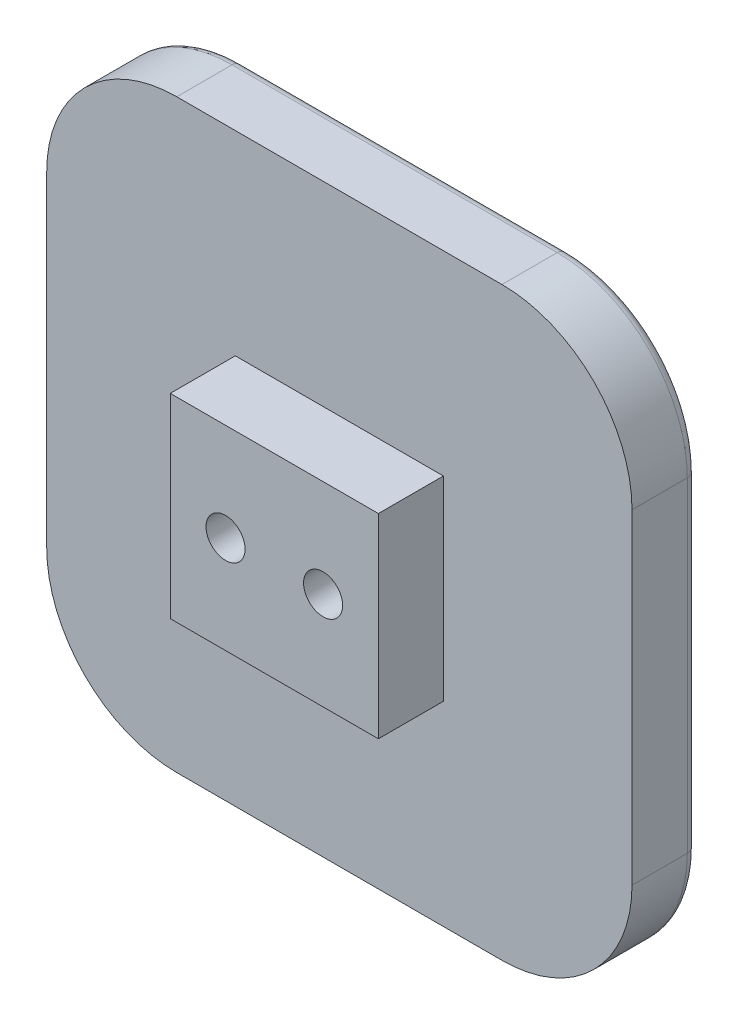
ISO-10303-21;
HEADER;
FILE_DESCRIPTION(('STEP AP214'),'2;1');
FILE_NAME('part.step','',(''),(''),'','','');
FILE_SCHEMA(('AUTOMOTIVE_DESIGN { 1 0 10303 214 1 1 1 1 }'));
ENDSEC;
DATA;
#1=APPLICATION_CONTEXT('core data for automotive mechanical design processes');
#2=APPLICATION_PROTOCOL_DEFINITION('international standard','automotive_design',2000,#1);
#3=PRODUCT_CONTEXT('',#1,'mechanical');
#4=PRODUCT('Part','Part','',(#3));
#5=PRODUCT_RELATED_PRODUCT_CATEGORY('part','',(#4));
#6=PRODUCT_DEFINITION_FORMATION('','',#4);
#7=PRODUCT_DEFINITION_CONTEXT('part definition',#1,'design');
#8=PRODUCT_DEFINITION('design','',#6,#7);
#9=PRODUCT_DEFINITION_SHAPE('','',#8);
#10=(LENGTH_UNIT() NAMED_UNIT(*) SI_UNIT(.MILLI.,.METRE.));
#11=(NAMED_UNIT(*) PLANE_ANGLE_UNIT() SI_UNIT($,.RADIAN.));
#12=(NAMED_UNIT(*) SI_UNIT($,.STERADIAN.) SOLID_ANGLE_UNIT());
#13=UNCERTAINTY_MEASURE_WITH_UNIT(LENGTH_MEASURE(1.E-05),#10,'distance_accuracy_value','');
#14=(GEOMETRIC_REPRESENTATION_CONTEXT(3) GLOBAL_UNCERTAINTY_ASSIGNED_CONTEXT((#13)) GLOBAL_UNIT_ASSIGNED_CONTEXT((#10,
#11,#12)) REPRESENTATION_CONTEXT('',''));
#15=CARTESIAN_POINT('',(0.,0.,0.));
#16=DIRECTION('',(0.,0.,1.));
#17=DIRECTION('',(1.,0.,0.));
#18=AXIS2_PLACEMENT_3D('',#15,#16,#17);
#19=CARTESIAN_POINT('',(-12.5413669644873,38.8891123439667,27.));
#20=DIRECTION('',(0.,1.,0.));
#21=DIRECTION('',(0.,0.,1.));
#22=AXIS2_PLACEMENT_3D('',#19,#20,#21);
#23=PLANE('',#22);
#24=DIRECTION('',(0.,0.,-1.));
#25=VECTOR('',#24,1.);
#26=CARTESIAN_POINT('',(19.4586330355127,38.8891123439667,27.));
#27=LINE('',#26,#25);
#28=CARTESIAN_POINT('',(19.4586330355127,38.8891123439667,20.));
#29=VERTEX_POINT('',#28);
#30=CARTESIAN_POINT('',(19.4586330355127,38.8891123439667,10.));
#31=VERTEX_POINT('',#30);
#32=EDGE_CURVE('E341',#29,#31,#27,.T.);
#33=ORIENTED_EDGE('',*,*,#32,.T.);
#34=DIRECTION('',(1.,0.,0.));
#35=VECTOR('',#34,1.);
#36=CARTESIAN_POINT('',(-12.5413669644873,38.8891123439667,10.));
#37=LINE('',#36,#35);
#38=CARTESIAN_POINT('',(-12.5413669644873,38.8891123439667,10.));
#39=VERTEX_POINT('',#38);
#40=EDGE_CURVE('E158',#39,#31,#37,.T.);
#41=ORIENTED_EDGE('',*,*,#40,.F.);
#42=DIRECTION('',(0.,0.,-1.));
#43=VECTOR('',#42,1.);
#44=CARTESIAN_POINT('',(-12.5413669644873,38.8891123439667,27.));
#45=LINE('',#44,#43);
#46=CARTESIAN_POINT('',(-12.5413669644873,38.8891123439667,20.));
#47=VERTEX_POINT('',#46);
#48=EDGE_CURVE('E338',#47,#39,#45,.T.);
#49=ORIENTED_EDGE('',*,*,#48,.F.);
#50=DIRECTION('',(1.,0.,0.));
#51=VECTOR('',#50,1.);
#52=CARTESIAN_POINT('',(28.4586330355127,38.8891123439667,20.));
#53=LINE('',#52,#51);
#54=EDGE_CURVE('E334',#47,#29,#53,.T.);
#55=ORIENTED_EDGE('',*,*,#54,.T.);
#56=EDGE_LOOP('',(#33,#41,#49,#55));
#57=FACE_BOUND('',#56,.T.);
#58=ADVANCED_FACE('F33',(#57),#23,.T.);
#59=CARTESIAN_POINT('',(28.4586330355127,48.8891123439667,0.));
#60=DIRECTION('',(0.,0.,-1.));
#61=DIRECTION('',(-1.,0.,0.));
#62=AXIS2_PLACEMENT_3D('',#59,#60,#61);
#63=PLANE('',#62);
#64=DIRECTION('',(0.,1.,0.));
#65=VECTOR('',#64,1.);
#66=CARTESIAN_POINT('',(46.9586330355127,-1.11088765603329,0.));
#67=LINE('',#66,#65);
#68=CARTESIAN_POINT('',(46.9586330355127,48.8891123439667,0.));
#69=VERTEX_POINT('',#68);
#70=CARTESIAN_POINT('',(46.9586330355127,-1.11088765603329,0.));
#71=VERTEX_POINT('',#70);
#72=EDGE_CURVE('E213',#69,#71,#67,.F.);
#73=ORIENTED_EDGE('',*,*,#72,.T.);
#74=CARTESIAN_POINT('',(28.4586330355126,-1.11088765603327,0.));
#75=DIRECTION('',(0.,0.,-1.));
#76=DIRECTION('',(-1.,0.,0.));
#77=AXIS2_PLACEMENT_3D('',#74,#75,#76);
#78=CIRCLE('',#77,18.5);
#79=CARTESIAN_POINT('',(28.4586330355126,-19.6108876560332,0.));
#80=VERTEX_POINT('',#79);
#81=EDGE_CURVE('E227',#71,#80,#78,.T.);
#82=ORIENTED_EDGE('',*,*,#81,.T.);
#83=DIRECTION('',(1.,0.,0.));
#84=VECTOR('',#83,1.);
#85=CARTESIAN_POINT('',(-21.5413669644874,-19.6108876560332,0.));
#86=LINE('',#85,#84);
#87=CARTESIAN_POINT('',(-21.5413669644874,-19.6108876560332,0.));
#88=VERTEX_POINT('',#87);
#89=EDGE_CURVE('E225',#80,#88,#86,.F.);
#90=ORIENTED_EDGE('',*,*,#89,.T.);
#91=CARTESIAN_POINT('',(-21.5413669644873,-1.11088765603323,0.));
#92=DIRECTION('',(0.,0.,-1.));
#93=DIRECTION('',(-1.,0.,0.));
#94=AXIS2_PLACEMENT_3D('',#91,#92,#93);
#95=CIRCLE('',#94,18.5);
#96=CARTESIAN_POINT('',(-40.0413669644873,-1.11088765603322,0.));
#97=VERTEX_POINT('',#96);
#98=EDGE_CURVE('E223',#88,#97,#95,.T.);
#99=ORIENTED_EDGE('',*,*,#98,.T.);
#100=DIRECTION('',(0.,-1.,0.));
#101=VECTOR('',#100,1.);
#102=CARTESIAN_POINT('',(-40.0413669644873,48.8891123439667,0.));
#103=LINE('',#102,#101);
#104=CARTESIAN_POINT('',(-40.0413669644873,48.8891123439667,0.));
#105=VERTEX_POINT('',#104);
#106=EDGE_CURVE('E221',#97,#105,#103,.F.);
#107=ORIENTED_EDGE('',*,*,#106,.T.);
#108=CARTESIAN_POINT('',(-21.5413669644873,48.8891123439667,0.));
#109=DIRECTION('',(0.,0.,-1.));
#110=DIRECTION('',(-1.,0.,0.));
#111=AXIS2_PLACEMENT_3D('',#108,#109,#110);
#112=CIRCLE('',#111,18.5);
#113=CARTESIAN_POINT('',(-21.5413669644873,67.3891123439667,0.));
#114=VERTEX_POINT('',#113);
#115=EDGE_CURVE('E219',#105,#114,#112,.T.);
#116=ORIENTED_EDGE('',*,*,#115,.T.);
#117=DIRECTION('',(-1.,0.,0.));
#118=VECTOR('',#117,1.);
#119=CARTESIAN_POINT('',(28.4586330355127,67.3891123439667,0.));
#120=LINE('',#119,#118);
#121=CARTESIAN_POINT('',(28.4586330355127,67.3891123439667,0.));
#122=VERTEX_POINT('',#121);
#123=EDGE_CURVE('E217',#114,#122,#120,.F.);
#124=ORIENTED_EDGE('',*,*,#123,.T.);
#125=CARTESIAN_POINT('',(28.4586330355127,48.8891123439667,0.));
#126=DIRECTION('',(0.,0.,-1.));
#127=DIRECTION('',(-1.,0.,0.));
#128=AXIS2_PLACEMENT_3D('',#125,#126,#127);
#129=CIRCLE('',#128,18.5);
#130=EDGE_CURVE('E215',#122,#69,#129,.T.);
#131=ORIENTED_EDGE('',*,*,#130,.T.);
#132=EDGE_LOOP('',(#73,#82,#90,#99,#107,#116,#124,#131));
#133=FACE_BOUND('',#132,.T.);
#134=CARTESIAN_POINT('',(-4.04136696448732,23.8891123439667,0.));
#135=DIRECTION('',(0.,0.,1.));
#136=DIRECTION('',(1.,0.,0.));
#137=AXIS2_PLACEMENT_3D('',#134,#135,#136);
#138=CIRCLE('',#137,6.);
#139=CARTESIAN_POINT('',(1.95863303551269,23.8891123439667,0.));
#140=VERTEX_POINT('',#139);
#141=EDGE_CURVE('E266',#140,#140,#138,.T.);
#142=ORIENTED_EDGE('',*,*,#141,.T.);
#143=EDGE_LOOP('',(#142));
#144=FACE_BOUND('',#143,.T.);
#145=CARTESIAN_POINT('',(10.9586330355127,23.8891123439667,0.));
#146=DIRECTION('',(0.,0.,1.));
#147=DIRECTION('',(1.,0.,0.));
#148=AXIS2_PLACEMENT_3D('',#145,#146,#147);
#149=CIRCLE('',#148,6.);
#150=CARTESIAN_POINT('',(16.9586330355127,23.8891123439667,0.));
#151=VERTEX_POINT('',#150);
#152=EDGE_CURVE('E211',#151,#151,#149,.T.);
#153=ORIENTED_EDGE('',*,*,#152,.T.);
#154=EDGE_LOOP('',(#153));
#155=FACE_BOUND('',#154,.T.);
#156=ADVANCED_FACE('F370',(#133,#144,#155),#63,.T.);
#157=CARTESIAN_POINT('',(-12.5413669644873,68.8891123439667,30.));
#158=DIRECTION('',(-1.,0.,0.));
#159=DIRECTION('',(0.,0.,1.));
#160=AXIS2_PLACEMENT_3D('',#157,#158,#159);
#161=PLANE('',#160);
#162=DIRECTION('',(0.,1.,0.));
#163=VECTOR('',#162,1.);
#164=CARTESIAN_POINT('',(-12.5413669644873,68.8891123439667,10.));
#165=LINE('',#164,#163);
#166=CARTESIAN_POINT('',(-12.5413669644873,8.88911234396675,10.));
#167=VERTEX_POINT('',#166);
#168=EDGE_CURVE('E192',#167,#39,#165,.T.);
#169=ORIENTED_EDGE('',*,*,#168,.F.);
#170=DIRECTION('',(0.,0.,-1.));
#171=VECTOR('',#170,1.);
#172=CARTESIAN_POINT('',(-12.5413669644873,8.88911234396675,28.));
#173=LINE('',#172,#171);
#174=CARTESIAN_POINT('',(-12.5413669644873,8.88911234396675,20.));
#175=VERTEX_POINT('',#174);
#176=EDGE_CURVE('E153',#175,#167,#173,.T.);
#177=ORIENTED_EDGE('',*,*,#176,.F.);
#178=DIRECTION('',(0.,1.,0.));
#179=VECTOR('',#178,1.);
#180=CARTESIAN_POINT('',(-12.5413669644873,48.8891123439667,20.));
#181=LINE('',#180,#179);
#182=EDGE_CURVE('E329',#175,#47,#181,.T.);
#183=ORIENTED_EDGE('',*,*,#182,.T.);
#184=ORIENTED_EDGE('',*,*,#48,.T.);
#185=EDGE_LOOP('',(#169,#177,#183,#184));
#186=FACE_BOUND('',#185,.T.);
#187=ADVANCED_FACE('F346',(#186),#161,.T.);
#188=CARTESIAN_POINT('',(19.4586330355127,68.8891123439667,30.));
#189=DIRECTION('',(1.,0.,0.));
#190=DIRECTION('',(0.,0.,-1.));
#191=AXIS2_PLACEMENT_3D('',#188,#189,#190);
#192=PLANE('',#191);
#193=DIRECTION('',(0.,-1.,0.));
#194=VECTOR('',#193,1.);
#195=CARTESIAN_POINT('',(19.4586330355127,48.8891123439667,20.));
#196=LINE('',#195,#194);
#197=CARTESIAN_POINT('',(19.4586330355127,8.88911234396675,20.));
#198=VERTEX_POINT('',#197);
#199=EDGE_CURVE('E167',#29,#198,#196,.T.);
#200=ORIENTED_EDGE('',*,*,#199,.T.);
#201=DIRECTION('',(0.,0.,-1.));
#202=VECTOR('',#201,1.);
#203=CARTESIAN_POINT('',(19.4586330355127,8.88911234396675,28.));
#204=LINE('',#203,#202);
#205=CARTESIAN_POINT('',(19.4586330355127,8.88911234396675,10.));
#206=VERTEX_POINT('',#205);
#207=EDGE_CURVE('E150',#198,#206,#204,.T.);
#208=ORIENTED_EDGE('',*,*,#207,.T.);
#209=DIRECTION('',(0.,-1.,0.));
#210=VECTOR('',#209,1.);
#211=CARTESIAN_POINT('',(19.4586330355127,68.8891123439667,10.));
#212=LINE('',#211,#210);
#213=EDGE_CURVE('E165',#31,#206,#212,.T.);
#214=ORIENTED_EDGE('',*,*,#213,.F.);
#215=ORIENTED_EDGE('',*,*,#32,.F.);
#216=EDGE_LOOP('',(#200,#208,#214,#215));
#217=FACE_BOUND('',#216,.T.);
#218=ADVANCED_FACE('F164',(#217),#192,.T.);
#219=CARTESIAN_POINT('',(-21.5413669644873,-21.1108876560332,20.));
#220=DIRECTION('',(0.,1.,0.));
#221=DIRECTION('',(0.,0.,1.));
#222=AXIS2_PLACEMENT_3D('',#219,#220,#221);
#223=PLANE('',#222);
#224=DIRECTION('',(0.,0.,-1.));
#225=VECTOR('',#224,1.);
#226=CARTESIAN_POINT('',(-21.5413669644874,-21.1108876560332,10.));
#227=LINE('',#226,#225);
#228=CARTESIAN_POINT('',(-21.5413669644874,-21.1108876560332,10.));
#229=VERTEX_POINT('',#228);
#230=CARTESIAN_POINT('',(-21.5413669644874,-21.1108876560332,1.5));
#231=VERTEX_POINT('',#230);
#232=EDGE_CURVE('E285',#229,#231,#227,.T.);
#233=ORIENTED_EDGE('',*,*,#232,.T.);
#234=DIRECTION('',(1.,0.,0.));
#235=VECTOR('',#234,1.);
#236=CARTESIAN_POINT('',(28.4586330355126,-21.1108876560332,1.5));
#237=LINE('',#236,#235);
#238=CARTESIAN_POINT('',(28.4586330355126,-21.1108876560333,1.5));
#239=VERTEX_POINT('',#238);
#240=EDGE_CURVE('E233',#231,#239,#237,.T.);
#241=ORIENTED_EDGE('',*,*,#240,.T.);
#242=DIRECTION('',(0.,0.,-1.));
#243=VECTOR('',#242,1.);
#244=CARTESIAN_POINT('',(28.4586330355126,-21.1108876560333,10.));
#245=LINE('',#244,#243);
#246=CARTESIAN_POINT('',(28.4586330355126,-21.1108876560332,10.));
#247=VERTEX_POINT('',#246);
#248=EDGE_CURVE('E295',#247,#239,#245,.T.);
#249=ORIENTED_EDGE('',*,*,#248,.F.);
#250=DIRECTION('',(1.,0.,0.));
#251=VECTOR('',#250,1.);
#252=CARTESIAN_POINT('',(48.4586330355127,-21.1108876560332,10.));
#253=LINE('',#252,#251);
#254=EDGE_CURVE('E173',#229,#247,#253,.T.);
#255=ORIENTED_EDGE('',*,*,#254,.F.);
#256=EDGE_LOOP('',(#233,#241,#249,#255));
#257=FACE_BOUND('',#256,.T.);
#258=ADVANCED_FACE('F353',(#257),#223,.F.);
#259=CARTESIAN_POINT('',(28.4586330355127,48.8891123439667,20.));
#260=DIRECTION('',(0.,0.,-1.));
#261=DIRECTION('',(-1.,0.,0.));
#262=AXIS2_PLACEMENT_3D('',#259,#260,#261);
#263=PLANE('',#262);
#264=CARTESIAN_POINT('',(10.9586330355127,23.8891123439667,20.));
#265=DIRECTION('',(0.,0.,-1.));
#266=DIRECTION('',(-1.,0.,0.));
#267=AXIS2_PLACEMENT_3D('',#264,#265,#266);
#268=CIRCLE('',#267,3.);
#269=CARTESIAN_POINT('',(7.95863303551268,23.8891123439667,20.));
#270=VERTEX_POINT('',#269);
#271=EDGE_CURVE('E201',#270,#270,#268,.F.);
#272=ORIENTED_EDGE('',*,*,#271,.F.);
#273=EDGE_LOOP('',(#272));
#274=FACE_BOUND('',#273,.T.);
#275=CARTESIAN_POINT('',(-4.04136696448732,23.8891123439667,20.));
#276=DIRECTION('',(0.,0.,-1.));
#277=DIRECTION('',(-1.,0.,0.));
#278=AXIS2_PLACEMENT_3D('',#275,#276,#277);
#279=CIRCLE('',#278,3.);
#280=CARTESIAN_POINT('',(-7.04136696448732,23.8891123439667,20.));
#281=VERTEX_POINT('',#280);
#282=EDGE_CURVE('E159',#281,#281,#279,.F.);
#283=ORIENTED_EDGE('',*,*,#282,.F.);
#284=EDGE_LOOP('',(#283));
#285=FACE_BOUND('',#284,.T.);
#286=DIRECTION('',(-1.,0.,0.));
#287=VECTOR('',#286,1.);
#288=CARTESIAN_POINT('',(28.4586330355127,8.88911234396675,20.));
#289=LINE('',#288,#287);
#290=EDGE_CURVE('E186',#198,#175,#289,.T.);
#291=ORIENTED_EDGE('',*,*,#290,.F.);
#292=ORIENTED_EDGE('',*,*,#199,.F.);
#293=ORIENTED_EDGE('',*,*,#54,.F.);
#294=ORIENTED_EDGE('',*,*,#182,.F.);
#295=EDGE_LOOP('',(#291,#292,#293,#294));
#296=FACE_BOUND('',#295,.T.);
#297=ADVANCED_FACE('F350',(#274,#285,#296),#263,.F.);
#298=CARTESIAN_POINT('',(-21.5413669644873,68.8891123439667,20.));
#299=DIRECTION('',(0.,-1.,0.));
#300=DIRECTION('',(0.,0.,-1.));
#301=AXIS2_PLACEMENT_3D('',#298,#299,#300);
#302=PLANE('',#301);
#303=DIRECTION('',(0.,0.,-1.));
#304=VECTOR('',#303,1.);
#305=CARTESIAN_POINT('',(28.4586330355127,68.8891123439667,10.));
#306=LINE('',#305,#304);
#307=CARTESIAN_POINT('',(28.4586330355127,68.8891123439667,10.));
#308=VERTEX_POINT('',#307);
#309=CARTESIAN_POINT('',(28.4586330355127,68.8891123439667,1.5));
#310=VERTEX_POINT('',#309);
#311=EDGE_CURVE('E301',#308,#310,#306,.T.);
#312=ORIENTED_EDGE('',*,*,#311,.T.);
#313=DIRECTION('',(-1.,0.,0.));
#314=VECTOR('',#313,1.);
#315=CARTESIAN_POINT('',(-21.5413669644873,68.8891123439667,1.5));
#316=LINE('',#315,#314);
#317=CARTESIAN_POINT('',(-21.5413669644873,68.8891123439667,1.5));
#318=VERTEX_POINT('',#317);
#319=EDGE_CURVE('E241',#310,#318,#316,.T.);
#320=ORIENTED_EDGE('',*,*,#319,.T.);
#321=DIRECTION('',(0.,0.,-1.));
#322=VECTOR('',#321,1.);
#323=CARTESIAN_POINT('',(-21.5413669644873,68.8891123439667,10.));
#324=LINE('',#323,#322);
#325=CARTESIAN_POINT('',(-21.5413669644873,68.8891123439667,10.));
#326=VERTEX_POINT('',#325);
#327=EDGE_CURVE('E180',#326,#318,#324,.T.);
#328=ORIENTED_EDGE('',*,*,#327,.F.);
#329=DIRECTION('',(-1.,0.,0.));
#330=VECTOR('',#329,1.);
#331=CARTESIAN_POINT('',(-41.5413669644873,68.8891123439667,10.));
#332=LINE('',#331,#330);
#333=EDGE_CURVE('E198',#308,#326,#332,.T.);
#334=ORIENTED_EDGE('',*,*,#333,.F.);
#335=EDGE_LOOP('',(#312,#320,#328,#334));
#336=FACE_BOUND('',#335,.T.);
#337=ADVANCED_FACE('F352',(#336),#302,.F.);
#338=CARTESIAN_POINT('',(-41.5413669644873,68.8891123439667,10.));
#339=DIRECTION('',(1.,0.,0.));
#340=DIRECTION('',(0.,0.,-1.));
#341=AXIS2_PLACEMENT_3D('',#338,#339,#340);
#342=PLANE('',#341);
#343=DIRECTION('',(0.,0.,-1.));
#344=VECTOR('',#343,1.);
#345=CARTESIAN_POINT('',(-41.5413669644873,48.8891123439667,10.));
#346=LINE('',#345,#344);
#347=CARTESIAN_POINT('',(-41.5413669644873,48.8891123439667,10.));
#348=VERTEX_POINT('',#347);
#349=CARTESIAN_POINT('',(-41.5413669644873,48.8891123439667,1.5));
#350=VERTEX_POINT('',#349);
#351=EDGE_CURVE('E174',#348,#350,#346,.T.);
#352=ORIENTED_EDGE('',*,*,#351,.T.);
#353=DIRECTION('',(0.,-1.,0.));
#354=VECTOR('',#353,1.);
#355=CARTESIAN_POINT('',(-41.5413669644873,-1.11088765603322,1.5));
#356=LINE('',#355,#354);
#357=CARTESIAN_POINT('',(-41.5413669644873,-1.11088765603322,1.5));
#358=VERTEX_POINT('',#357);
#359=EDGE_CURVE('E237',#350,#358,#356,.T.);
#360=ORIENTED_EDGE('',*,*,#359,.T.);
#361=DIRECTION('',(0.,0.,-1.));
#362=VECTOR('',#361,1.);
#363=CARTESIAN_POINT('',(-41.5413669644873,-1.11088765603322,10.));
#364=LINE('',#363,#362);
#365=CARTESIAN_POINT('',(-41.5413669644873,-1.11088765603319,10.));
#366=VERTEX_POINT('',#365);
#367=EDGE_CURVE('E288',#366,#358,#364,.T.);
#368=ORIENTED_EDGE('',*,*,#367,.F.);
#369=DIRECTION('',(0.,-1.,0.));
#370=VECTOR('',#369,1.);
#371=CARTESIAN_POINT('',(-41.5413669644873,68.8891123439667,10.));
#372=LINE('',#371,#370);
#373=EDGE_CURVE('E195',#348,#366,#372,.T.);
#374=ORIENTED_EDGE('',*,*,#373,.F.);
#375=EDGE_LOOP('',(#352,#360,#368,#374));
#376=FACE_BOUND('',#375,.T.);
#377=ADVANCED_FACE('F321',(#376),#342,.F.);
#378=CARTESIAN_POINT('',(0.,0.,10.));
#379=DIRECTION('',(0.,0.,-1.));
#380=DIRECTION('',(-1.,0.,0.));
#381=AXIS2_PLACEMENT_3D('',#378,#379,#380);
#382=PLANE('',#381);
#383=DIRECTION('',(-1.,0.,0.));
#384=VECTOR('',#383,1.);
#385=CARTESIAN_POINT('',(-12.5413669644873,8.88911234396675,10.));
#386=LINE('',#385,#384);
#387=EDGE_CURVE('E147',#206,#167,#386,.T.);
#388=ORIENTED_EDGE('',*,*,#387,.T.);
#389=ORIENTED_EDGE('',*,*,#168,.T.);
#390=ORIENTED_EDGE('',*,*,#40,.T.);
#391=ORIENTED_EDGE('',*,*,#213,.T.);
#392=EDGE_LOOP('',(#388,#389,#390,#391));
#393=FACE_BOUND('',#392,.T.);
#394=CARTESIAN_POINT('',(28.4586330355126,-1.11088765603327,10.));
#395=DIRECTION('',(0.,0.,-1.));
#396=DIRECTION('',(1.,0.,0.));
#397=AXIS2_PLACEMENT_3D('',#394,#395,#396);
#398=CIRCLE('',#397,20.);
#399=CARTESIAN_POINT('',(48.4586330355126,-1.11088765603329,10.));
#400=VERTEX_POINT('',#399);
#401=EDGE_CURVE('E291',#400,#247,#398,.T.);
#402=ORIENTED_EDGE('',*,*,#401,.F.);
#403=DIRECTION('',(0.,1.,0.));
#404=VECTOR('',#403,1.);
#405=CARTESIAN_POINT('',(48.4586330355127,68.8891123439667,10.));
#406=LINE('',#405,#404);
#407=CARTESIAN_POINT('',(48.4586330355127,48.8891123439667,10.));
#408=VERTEX_POINT('',#407);
#409=EDGE_CURVE('E177',#400,#408,#406,.T.);
#410=ORIENTED_EDGE('',*,*,#409,.T.);
#411=CARTESIAN_POINT('',(28.4586330355127,48.8891123439667,10.));
#412=DIRECTION('',(0.,0.,-1.));
#413=DIRECTION('',(-1.,0.,0.));
#414=AXIS2_PLACEMENT_3D('',#411,#412,#413);
#415=CIRCLE('',#414,20.);
#416=EDGE_CURVE('E298',#308,#408,#415,.T.);
#417=ORIENTED_EDGE('',*,*,#416,.F.);
#418=ORIENTED_EDGE('',*,*,#333,.T.);
#419=CARTESIAN_POINT('',(-21.5413669644873,48.8891123439667,10.));
#420=DIRECTION('',(0.,0.,-1.));
#421=DIRECTION('',(1.,0.,0.));
#422=AXIS2_PLACEMENT_3D('',#419,#420,#421);
#423=CIRCLE('',#422,20.);
#424=EDGE_CURVE('E305',#348,#326,#423,.T.);
#425=ORIENTED_EDGE('',*,*,#424,.F.);
#426=ORIENTED_EDGE('',*,*,#373,.T.);
#427=CARTESIAN_POINT('',(-21.5413669644873,-1.11088765603323,10.));
#428=DIRECTION('',(0.,0.,-1.));
#429=DIRECTION('',(-1.,0.,0.));
#430=AXIS2_PLACEMENT_3D('',#427,#428,#429);
#431=CIRCLE('',#430,20.);
#432=EDGE_CURVE('E168',#229,#366,#431,.T.);
#433=ORIENTED_EDGE('',*,*,#432,.F.);
#434=ORIENTED_EDGE('',*,*,#254,.T.);
#435=EDGE_LOOP('',(#402,#410,#417,#418,#425,#426,#433,#434));
#436=FACE_BOUND('',#435,.T.);
#437=ADVANCED_FACE('F170',(#393,#436),#382,.F.);
#438=CARTESIAN_POINT('',(48.4586330355127,68.8891123439667,10.));
#439=DIRECTION('',(-1.,0.,0.));
#440=DIRECTION('',(0.,0.,1.));
#441=AXIS2_PLACEMENT_3D('',#438,#439,#440);
#442=PLANE('',#441);
#443=DIRECTION('',(0.,0.,-1.));
#444=VECTOR('',#443,1.);
#445=CARTESIAN_POINT('',(48.4586330355126,-1.11088765603329,10.));
#446=LINE('',#445,#444);
#447=CARTESIAN_POINT('',(48.4586330355126,-1.11088765603329,1.5));
#448=VERTEX_POINT('',#447);
#449=EDGE_CURVE('E293',#400,#448,#446,.T.);
#450=ORIENTED_EDGE('',*,*,#449,.T.);
#451=DIRECTION('',(0.,1.,0.));
#452=VECTOR('',#451,1.);
#453=CARTESIAN_POINT('',(48.4586330355127,48.8891123439667,1.5));
#454=LINE('',#453,#452);
#455=CARTESIAN_POINT('',(48.4586330355127,48.8891123439667,1.5));
#456=VERTEX_POINT('',#455);
#457=EDGE_CURVE('E11',#448,#456,#454,.T.);
#458=ORIENTED_EDGE('',*,*,#457,.T.);
#459=DIRECTION('',(0.,0.,-1.));
#460=VECTOR('',#459,1.);
#461=CARTESIAN_POINT('',(48.4586330355127,48.8891123439667,10.));
#462=LINE('',#461,#460);
#463=EDGE_CURVE('E303',#408,#456,#462,.T.);
#464=ORIENTED_EDGE('',*,*,#463,.F.);
#465=ORIENTED_EDGE('',*,*,#409,.F.);
#466=EDGE_LOOP('',(#450,#458,#464,#465));
#467=FACE_BOUND('',#466,.T.);
#468=ADVANCED_FACE('F383',(#467),#442,.F.);
#469=CARTESIAN_POINT('',(-21.5413669644873,48.8891123439667,10.));
#470=DIRECTION('',(0.,0.,-1.));
#471=DIRECTION('',(-1.,0.,0.));
#472=AXIS2_PLACEMENT_3D('',#469,#470,#471);
#473=CYLINDRICAL_SURFACE('',#472,20.);
#474=ORIENTED_EDGE('',*,*,#327,.T.);
#475=CARTESIAN_POINT('',(-21.5413669644873,48.8891123439667,1.5));
#476=DIRECTION('',(0.,0.,-1.));
#477=DIRECTION('',(-1.,0.,0.));
#478=AXIS2_PLACEMENT_3D('',#475,#476,#477);
#479=CIRCLE('',#478,20.);
#480=EDGE_CURVE('E239',#318,#350,#479,.F.);
#481=ORIENTED_EDGE('',*,*,#480,.T.);
#482=ORIENTED_EDGE('',*,*,#351,.F.);
#483=ORIENTED_EDGE('',*,*,#424,.T.);
#484=EDGE_LOOP('',(#474,#481,#482,#483));
#485=FACE_BOUND('',#484,.T.);
#486=ADVANCED_FACE('F310',(#485),#473,.T.);
#487=CARTESIAN_POINT('',(28.4586330355127,48.8891123439667,10.));
#488=DIRECTION('',(0.,0.,-1.));
#489=DIRECTION('',(-1.,0.,0.));
#490=AXIS2_PLACEMENT_3D('',#487,#488,#489);
#491=CYLINDRICAL_SURFACE('',#490,20.);
#492=ORIENTED_EDGE('',*,*,#463,.T.);
#493=CARTESIAN_POINT('',(28.4586330355127,48.8891123439667,1.5));
#494=DIRECTION('',(0.,0.,-1.));
#495=DIRECTION('',(-1.,0.,0.));
#496=AXIS2_PLACEMENT_3D('',#493,#494,#495);
#497=CIRCLE('',#496,20.);
#498=EDGE_CURVE('E42',#456,#310,#497,.F.);
#499=ORIENTED_EDGE('',*,*,#498,.T.);
#500=ORIENTED_EDGE('',*,*,#311,.F.);
#501=ORIENTED_EDGE('',*,*,#416,.T.);
#502=EDGE_LOOP('',(#492,#499,#500,#501));
#503=FACE_BOUND('',#502,.T.);
#504=ADVANCED_FACE('F390',(#503),#491,.T.);
#505=CARTESIAN_POINT('',(28.4586330355126,-1.11088765603327,10.));
#506=DIRECTION('',(0.,0.,-1.));
#507=DIRECTION('',(-1.,0.,0.));
#508=AXIS2_PLACEMENT_3D('',#505,#506,#507);
#509=CYLINDRICAL_SURFACE('',#508,20.);
#510=ORIENTED_EDGE('',*,*,#248,.T.);
#511=CARTESIAN_POINT('',(28.4586330355126,-1.11088765603327,1.5));
#512=DIRECTION('',(0.,0.,-1.));
#513=DIRECTION('',(-1.,0.,0.));
#514=AXIS2_PLACEMENT_3D('',#511,#512,#513);
#515=CIRCLE('',#514,20.);
#516=EDGE_CURVE('E230',#239,#448,#515,.F.);
#517=ORIENTED_EDGE('',*,*,#516,.T.);
#518=ORIENTED_EDGE('',*,*,#449,.F.);
#519=ORIENTED_EDGE('',*,*,#401,.T.);
#520=EDGE_LOOP('',(#510,#517,#518,#519));
#521=FACE_BOUND('',#520,.T.);
#522=ADVANCED_FACE('F393',(#521),#509,.T.);
#523=CARTESIAN_POINT('',(-21.5413669644873,-1.11088765603323,10.));
#524=DIRECTION('',(0.,0.,-1.));
#525=DIRECTION('',(-1.,0.,0.));
#526=AXIS2_PLACEMENT_3D('',#523,#524,#525);
#527=CYLINDRICAL_SURFACE('',#526,20.);
#528=ORIENTED_EDGE('',*,*,#367,.T.);
#529=CARTESIAN_POINT('',(-21.5413669644873,-1.11088765603323,1.5));
#530=DIRECTION('',(0.,0.,-1.));
#531=DIRECTION('',(-1.,0.,0.));
#532=AXIS2_PLACEMENT_3D('',#529,#530,#531);
#533=CIRCLE('',#532,20.);
#534=EDGE_CURVE('E235',#358,#231,#533,.F.);
#535=ORIENTED_EDGE('',*,*,#534,.T.);
#536=ORIENTED_EDGE('',*,*,#232,.F.);
#537=ORIENTED_EDGE('',*,*,#432,.T.);
#538=EDGE_LOOP('',(#528,#535,#536,#537));
#539=FACE_BOUND('',#538,.T.);
#540=ADVANCED_FACE('F325',(#539),#527,.T.);
#541=CARTESIAN_POINT('',(-12.5413669644873,8.88911234396675,28.));
#542=DIRECTION('',(0.,-1.,0.));
#543=DIRECTION('',(0.,0.,-1.));
#544=AXIS2_PLACEMENT_3D('',#541,#542,#543);
#545=PLANE('',#544);
#546=ORIENTED_EDGE('',*,*,#387,.F.);
#547=ORIENTED_EDGE('',*,*,#207,.F.);
#548=ORIENTED_EDGE('',*,*,#290,.T.);
#549=ORIENTED_EDGE('',*,*,#176,.T.);
#550=EDGE_LOOP('',(#546,#547,#548,#549));
#551=FACE_BOUND('',#550,.T.);
#552=ADVANCED_FACE('F149',(#551),#545,.T.);
#553=CARTESIAN_POINT('',(-4.04136696448732,23.8891123439667,22.));
#554=DIRECTION('',(0.,0.,-1.));
#555=DIRECTION('',(-1.,0.,0.));
#556=AXIS2_PLACEMENT_3D('',#553,#554,#555);
#557=CYLINDRICAL_SURFACE('',#556,3.);
#558=CARTESIAN_POINT('',(-4.04136696448732,23.8891123439667,5.));
#559=DIRECTION('',(0.,0.,1.));
#560=DIRECTION('',(1.,0.,0.));
#561=AXIS2_PLACEMENT_3D('',#558,#559,#560);
#562=CIRCLE('',#561,3.);
#563=CARTESIAN_POINT('',(-1.04136696448732,23.8891123439667,5.));
#564=VERTEX_POINT('',#563);
#565=EDGE_CURVE('E208',#564,#564,#562,.T.);
#566=ORIENTED_EDGE('',*,*,#565,.F.);
#567=EDGE_LOOP('',(#566));
#568=FACE_BOUND('',#567,.T.);
#569=ORIENTED_EDGE('',*,*,#282,.T.);
#570=EDGE_LOOP('',(#569));
#571=FACE_BOUND('',#570,.T.);
#572=ADVANCED_FACE('F401',(#568,#571),#557,.F.);
#573=CARTESIAN_POINT('',(10.9586330355127,23.8891123439667,22.));
#574=DIRECTION('',(0.,0.,-1.));
#575=DIRECTION('',(-1.,0.,0.));
#576=AXIS2_PLACEMENT_3D('',#573,#574,#575);
#577=CYLINDRICAL_SURFACE('',#576,3.);
#578=CARTESIAN_POINT('',(10.9586330355127,23.8891123439667,5.));
#579=DIRECTION('',(0.,0.,1.));
#580=DIRECTION('',(1.,0.,0.));
#581=AXIS2_PLACEMENT_3D('',#578,#579,#580);
#582=CIRCLE('',#581,3.);
#583=CARTESIAN_POINT('',(13.9586330355127,23.8891123439667,5.));
#584=VERTEX_POINT('',#583);
#585=EDGE_CURVE('E204',#584,#584,#582,.T.);
#586=ORIENTED_EDGE('',*,*,#585,.F.);
#587=EDGE_LOOP('',(#586));
#588=FACE_BOUND('',#587,.T.);
#589=ORIENTED_EDGE('',*,*,#271,.T.);
#590=EDGE_LOOP('',(#589));
#591=FACE_BOUND('',#590,.T.);
#592=ADVANCED_FACE('F404',(#588,#591),#577,.F.);
#593=CARTESIAN_POINT('',(10.9586330355127,23.8891123439667,5.));
#594=DIRECTION('',(0.,0.,-1.));
#595=DIRECTION('',(-1.,0.,0.));
#596=AXIS2_PLACEMENT_3D('',#593,#594,#595);
#597=CYLINDRICAL_SURFACE('',#596,6.);
#598=CARTESIAN_POINT('',(10.9586330355127,23.8891123439667,5.));
#599=DIRECTION('',(0.,0.,1.));
#600=DIRECTION('',(1.,0.,0.));
#601=AXIS2_PLACEMENT_3D('',#598,#599,#600);
#602=CIRCLE('',#601,6.);
#603=CARTESIAN_POINT('',(16.9586330355127,23.8891123439667,5.));
#604=VERTEX_POINT('',#603);
#605=EDGE_CURVE('E207',#604,#604,#602,.T.);
#606=ORIENTED_EDGE('',*,*,#605,.T.);
#607=EDGE_LOOP('',(#606));
#608=FACE_BOUND('',#607,.T.);
#609=ORIENTED_EDGE('',*,*,#152,.F.);
#610=EDGE_LOOP('',(#609));
#611=FACE_BOUND('',#610,.T.);
#612=ADVANCED_FACE('F408',(#608,#611),#597,.F.);
#613=CARTESIAN_POINT('',(10.9586330355127,23.8891123439667,5.));
#614=DIRECTION('',(0.,0.,1.));
#615=DIRECTION('',(1.,0.,0.));
#616=AXIS2_PLACEMENT_3D('',#613,#614,#615);
#617=PLANE('',#616);
#618=ORIENTED_EDGE('',*,*,#585,.T.);
#619=EDGE_LOOP('',(#618));
#620=FACE_BOUND('',#619,.T.);
#621=ORIENTED_EDGE('',*,*,#605,.F.);
#622=EDGE_LOOP('',(#621));
#623=FACE_BOUND('',#622,.T.);
#624=ADVANCED_FACE('F412',(#620,#623),#617,.F.);
#625=CARTESIAN_POINT('',(-4.04136696448732,23.8891123439667,5.));
#626=DIRECTION('',(0.,0.,-1.));
#627=DIRECTION('',(-1.,0.,0.));
#628=AXIS2_PLACEMENT_3D('',#625,#626,#627);
#629=CYLINDRICAL_SURFACE('',#628,6.);
#630=CARTESIAN_POINT('',(-4.04136696448732,23.8891123439667,5.));
#631=DIRECTION('',(0.,0.,1.));
#632=DIRECTION('',(1.,0.,0.));
#633=AXIS2_PLACEMENT_3D('',#630,#631,#632);
#634=CIRCLE('',#633,6.);
#635=CARTESIAN_POINT('',(1.95863303551269,23.8891123439667,5.));
#636=VERTEX_POINT('',#635);
#637=EDGE_CURVE('E212',#636,#636,#634,.T.);
#638=ORIENTED_EDGE('',*,*,#637,.T.);
#639=EDGE_LOOP('',(#638));
#640=FACE_BOUND('',#639,.T.);
#641=ORIENTED_EDGE('',*,*,#141,.F.);
#642=EDGE_LOOP('',(#641));
#643=FACE_BOUND('',#642,.T.);
#644=ADVANCED_FACE('F416',(#640,#643),#629,.F.);
#645=CARTESIAN_POINT('',(-4.04136696448732,23.8891123439667,5.));
#646=DIRECTION('',(0.,0.,1.));
#647=DIRECTION('',(1.,0.,0.));
#648=AXIS2_PLACEMENT_3D('',#645,#646,#647);
#649=PLANE('',#648);
#650=ORIENTED_EDGE('',*,*,#565,.T.);
#651=EDGE_LOOP('',(#650));
#652=FACE_BOUND('',#651,.T.);
#653=ORIENTED_EDGE('',*,*,#637,.F.);
#654=EDGE_LOOP('',(#653));
#655=FACE_BOUND('',#654,.T.);
#656=ADVANCED_FACE('F420',(#652,#655),#649,.F.);
#657=CARTESIAN_POINT('',(-21.5413669644873,48.8891123439667,1.5));
#658=DIRECTION('',(0.,0.,-1.));
#659=DIRECTION('',(-1.,0.,0.));
#660=AXIS2_PLACEMENT_3D('',#657,#658,#659);
#661=TOROIDAL_SURFACE('',#660,18.5,1.5);
#662=CARTESIAN_POINT('',(-40.0413669644873,48.8891123439667,1.5));
#663=DIRECTION('',(0.,-1.,0.));
#664=DIRECTION('',(0.,0.,-1.));
#665=AXIS2_PLACEMENT_3D('',#662,#663,#664);
#666=CIRCLE('',#665,1.5);
#667=EDGE_CURVE('E259',#350,#105,#666,.T.);
#668=ORIENTED_EDGE('',*,*,#667,.F.);
#669=ORIENTED_EDGE('',*,*,#480,.F.);
#670=CARTESIAN_POINT('',(-21.5413669644873,67.3891123439667,1.5));
#671=DIRECTION('',(1.,0.,0.));
#672=DIRECTION('',(0.,0.,-1.));
#673=AXIS2_PLACEMENT_3D('',#670,#671,#672);
#674=CIRCLE('',#673,1.5);
#675=EDGE_CURVE('E37',#114,#318,#674,.T.);
#676=ORIENTED_EDGE('',*,*,#675,.F.);
#677=ORIENTED_EDGE('',*,*,#115,.F.);
#678=EDGE_LOOP('',(#668,#669,#676,#677));
#679=FACE_BOUND('',#678,.T.);
#680=ADVANCED_FACE('F35',(#679),#661,.T.);
#681=CARTESIAN_POINT('',(-21.5413669644873,67.3891123439667,1.5));
#682=DIRECTION('',(1.,0.,0.));
#683=DIRECTION('',(0.,0.,-1.));
#684=AXIS2_PLACEMENT_3D('',#681,#682,#683);
#685=CYLINDRICAL_SURFACE('',#684,1.5);
#686=ORIENTED_EDGE('',*,*,#675,.T.);
#687=ORIENTED_EDGE('',*,*,#319,.F.);
#688=CARTESIAN_POINT('',(28.4586330355127,67.3891123439667,1.5));
#689=DIRECTION('',(1.,0.,0.));
#690=DIRECTION('',(0.,0.,-1.));
#691=AXIS2_PLACEMENT_3D('',#688,#689,#690);
#692=CIRCLE('',#691,1.5);
#693=EDGE_CURVE('E257',#122,#310,#692,.T.);
#694=ORIENTED_EDGE('',*,*,#693,.F.);
#695=ORIENTED_EDGE('',*,*,#123,.F.);
#696=EDGE_LOOP('',(#686,#687,#694,#695));
#697=FACE_BOUND('',#696,.T.);
#698=ADVANCED_FACE('F427',(#697),#685,.T.);
#699=CARTESIAN_POINT('',(-40.0413669644873,68.8891123439667,1.5));
#700=DIRECTION('',(0.,1.,0.));
#701=DIRECTION('',(0.,0.,1.));
#702=AXIS2_PLACEMENT_3D('',#699,#700,#701);
#703=CYLINDRICAL_SURFACE('',#702,1.5);
#704=ORIENTED_EDGE('',*,*,#667,.T.);
#705=ORIENTED_EDGE('',*,*,#106,.F.);
#706=CARTESIAN_POINT('',(-40.0413669644873,-1.11088765603322,1.5));
#707=DIRECTION('',(0.,-1.,0.));
#708=DIRECTION('',(0.,0.,-1.));
#709=AXIS2_PLACEMENT_3D('',#706,#707,#708);
#710=CIRCLE('',#709,1.5);
#711=EDGE_CURVE('E254',#358,#97,#710,.T.);
#712=ORIENTED_EDGE('',*,*,#711,.F.);
#713=ORIENTED_EDGE('',*,*,#359,.F.);
#714=EDGE_LOOP('',(#704,#705,#712,#713));
#715=FACE_BOUND('',#714,.T.);
#716=ADVANCED_FACE('F317',(#715),#703,.T.);
#717=CARTESIAN_POINT('',(28.4586330355127,48.8891123439667,1.5));
#718=DIRECTION('',(0.,0.,-1.));
#719=DIRECTION('',(-1.,0.,0.));
#720=AXIS2_PLACEMENT_3D('',#717,#718,#719);
#721=TOROIDAL_SURFACE('',#720,18.5,1.5);
#722=ORIENTED_EDGE('',*,*,#693,.T.);
#723=ORIENTED_EDGE('',*,*,#498,.F.);
#724=CARTESIAN_POINT('',(46.9586330355127,48.8891123439667,1.5));
#725=DIRECTION('',(0.,-1.,0.));
#726=DIRECTION('',(0.,0.,-1.));
#727=AXIS2_PLACEMENT_3D('',#724,#725,#726);
#728=CIRCLE('',#727,1.5);
#729=EDGE_CURVE('E251',#69,#456,#728,.T.);
#730=ORIENTED_EDGE('',*,*,#729,.F.);
#731=ORIENTED_EDGE('',*,*,#130,.F.);
#732=EDGE_LOOP('',(#722,#723,#730,#731));
#733=FACE_BOUND('',#732,.T.);
#734=ADVANCED_FACE('F440',(#733),#721,.T.);
#735=CARTESIAN_POINT('',(-21.5413669644873,-1.11088765603323,1.5));
#736=DIRECTION('',(0.,0.,-1.));
#737=DIRECTION('',(-1.,0.,0.));
#738=AXIS2_PLACEMENT_3D('',#735,#736,#737);
#739=TOROIDAL_SURFACE('',#738,18.5,1.5);
#740=ORIENTED_EDGE('',*,*,#711,.T.);
#741=ORIENTED_EDGE('',*,*,#98,.F.);
#742=CARTESIAN_POINT('',(-21.5413669644874,-19.6108876560332,1.5));
#743=DIRECTION('',(1.,0.,0.));
#744=DIRECTION('',(0.,0.,-1.));
#745=AXIS2_PLACEMENT_3D('',#742,#743,#744);
#746=CIRCLE('',#745,1.5);
#747=EDGE_CURVE('E248',#231,#88,#746,.T.);
#748=ORIENTED_EDGE('',*,*,#747,.F.);
#749=ORIENTED_EDGE('',*,*,#534,.F.);
#750=EDGE_LOOP('',(#740,#741,#748,#749));
#751=FACE_BOUND('',#750,.T.);
#752=ADVANCED_FACE('F445',(#751),#739,.T.);
#753=CARTESIAN_POINT('',(46.9586330355127,68.8891123439667,1.5));
#754=DIRECTION('',(0.,-1.,0.));
#755=DIRECTION('',(0.,0.,-1.));
#756=AXIS2_PLACEMENT_3D('',#753,#754,#755);
#757=CYLINDRICAL_SURFACE('',#756,1.5);
#758=ORIENTED_EDGE('',*,*,#729,.T.);
#759=ORIENTED_EDGE('',*,*,#457,.F.);
#760=CARTESIAN_POINT('',(46.9586330355127,-1.11088765603329,1.5));
#761=DIRECTION('',(0.,-1.,0.));
#762=DIRECTION('',(1.,0.,0.));
#763=AXIS2_PLACEMENT_3D('',#760,#761,#762);
#764=CIRCLE('',#763,1.5);
#765=EDGE_CURVE('E246',#71,#448,#764,.T.);
#766=ORIENTED_EDGE('',*,*,#765,.F.);
#767=ORIENTED_EDGE('',*,*,#72,.F.);
#768=EDGE_LOOP('',(#758,#759,#766,#767));
#769=FACE_BOUND('',#768,.T.);
#770=ADVANCED_FACE('F449',(#769),#757,.T.);
#771=CARTESIAN_POINT('',(-21.5413669644873,-19.6108876560332,1.5));
#772=DIRECTION('',(-1.,0.,0.));
#773=DIRECTION('',(0.,0.,1.));
#774=AXIS2_PLACEMENT_3D('',#771,#772,#773);
#775=CYLINDRICAL_SURFACE('',#774,1.5);
#776=ORIENTED_EDGE('',*,*,#747,.T.);
#777=ORIENTED_EDGE('',*,*,#89,.F.);
#778=CARTESIAN_POINT('',(28.4586330355126,-19.6108876560332,1.5));
#779=DIRECTION('',(1.,0.,0.));
#780=DIRECTION('',(0.,0.,-1.));
#781=AXIS2_PLACEMENT_3D('',#778,#779,#780);
#782=CIRCLE('',#781,1.5);
#783=EDGE_CURVE('E244',#239,#80,#782,.T.);
#784=ORIENTED_EDGE('',*,*,#783,.F.);
#785=ORIENTED_EDGE('',*,*,#240,.F.);
#786=EDGE_LOOP('',(#776,#777,#784,#785));
#787=FACE_BOUND('',#786,.T.);
#788=ADVANCED_FACE('F453',(#787),#775,.T.);
#789=CARTESIAN_POINT('',(28.4586330355126,-1.11088765603327,1.5));
#790=DIRECTION('',(0.,0.,-1.));
#791=DIRECTION('',(-1.,0.,0.));
#792=AXIS2_PLACEMENT_3D('',#789,#790,#791);
#793=TOROIDAL_SURFACE('',#792,18.5,1.5);
#794=ORIENTED_EDGE('',*,*,#765,.T.);
#795=ORIENTED_EDGE('',*,*,#516,.F.);
#796=ORIENTED_EDGE('',*,*,#783,.T.);
#797=ORIENTED_EDGE('',*,*,#81,.F.);
#798=EDGE_LOOP('',(#794,#795,#796,#797));
#799=FACE_BOUND('',#798,.T.);
#800=ADVANCED_FACE('F457',(#799),#793,.T.);
#801=CLOSED_SHELL('',(#58,#156,#187,#218,#258,#297,#337,#377,#437,#468,#486,#504,#522,#540,#552,
#572,#592,#612,#624,#644,#656,#680,#698,#716,#734,#752,#770,#788,#800));
#802=MANIFOLD_SOLID_BREP('B2',#801);
#803=ADVANCED_BREP_SHAPE_REPRESENTATION('',(#18,#802),#14);
#804=SHAPE_DEFINITION_REPRESENTATION(#9,#803);
ENDSEC;
END-ISO-10303-21;
